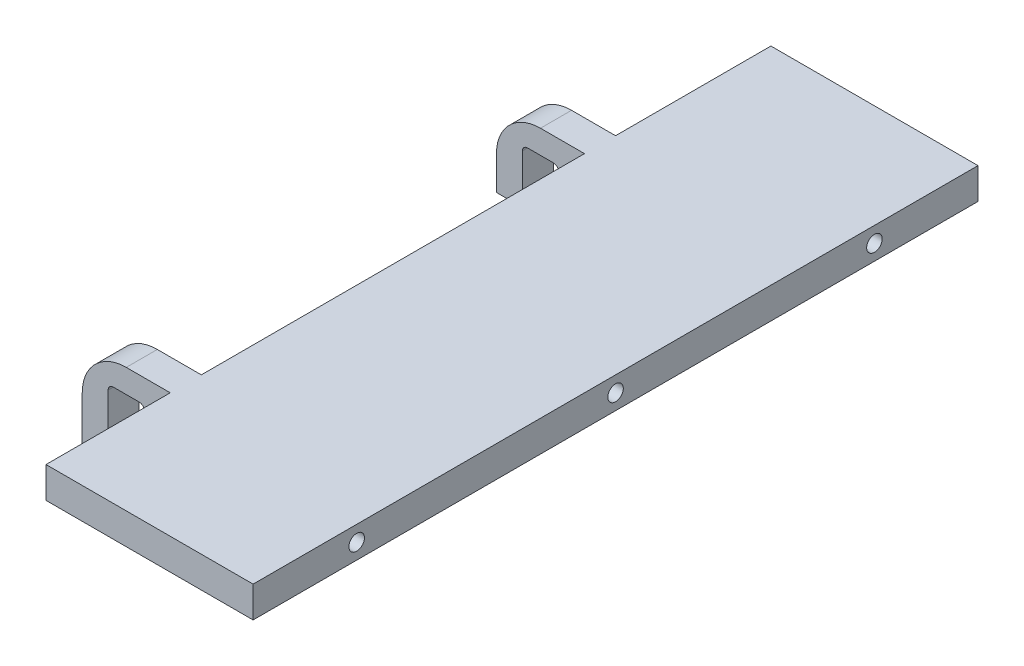
ISO-10303-21;
HEADER;
FILE_DESCRIPTION(('STEP AP214'),'2;1');
FILE_NAME('part.step','',(''),(''),'','','');
FILE_SCHEMA(('AUTOMOTIVE_DESIGN { 1 0 10303 214 1 1 1 1 }'));
ENDSEC;
DATA;
#1=APPLICATION_CONTEXT('core data for automotive mechanical design processes');
#2=APPLICATION_PROTOCOL_DEFINITION('international standard','automotive_design',2000,#1);
#3=PRODUCT_CONTEXT('',#1,'mechanical');
#4=PRODUCT('Part','Part','',(#3));
#5=PRODUCT_RELATED_PRODUCT_CATEGORY('part','',(#4));
#6=PRODUCT_DEFINITION_FORMATION('','',#4);
#7=PRODUCT_DEFINITION_CONTEXT('part definition',#1,'design');
#8=PRODUCT_DEFINITION('design','',#6,#7);
#9=PRODUCT_DEFINITION_SHAPE('','',#8);
#10=(LENGTH_UNIT() NAMED_UNIT(*) SI_UNIT(.MILLI.,.METRE.));
#11=(NAMED_UNIT(*) PLANE_ANGLE_UNIT() SI_UNIT($,.RADIAN.));
#12=(NAMED_UNIT(*) SI_UNIT($,.STERADIAN.) SOLID_ANGLE_UNIT());
#13=UNCERTAINTY_MEASURE_WITH_UNIT(LENGTH_MEASURE(1.E-05),#10,'distance_accuracy_value','');
#14=(GEOMETRIC_REPRESENTATION_CONTEXT(3) GLOBAL_UNCERTAINTY_ASSIGNED_CONTEXT((#13)) GLOBAL_UNIT_ASSIGNED_CONTEXT((#10,
#11,#12)) REPRESENTATION_CONTEXT('',''));
#15=CARTESIAN_POINT('',(0.,0.,0.));
#16=DIRECTION('',(0.,0.,1.));
#17=DIRECTION('',(1.,0.,0.));
#18=AXIS2_PLACEMENT_3D('',#15,#16,#17);
#19=CARTESIAN_POINT('',(11.,4.5,-15.));
#20=DIRECTION('',(-1.,0.,0.));
#21=DIRECTION('',(0.,0.,-1.));
#22=AXIS2_PLACEMENT_3D('',#19,#20,#21);
#23=PLANE('',#22);
#24=DIRECTION('',(0.,0.,-1.));
#25=VECTOR('',#24,1.);
#26=CARTESIAN_POINT('',(11.,7.5,-15.));
#27=LINE('',#26,#25);
#28=CARTESIAN_POINT('',(11.,7.5,40.));
#29=VERTEX_POINT('',#28);
#30=CARTESIAN_POINT('',(11.,7.5,3.));
#31=VERTEX_POINT('',#30);
#32=EDGE_CURVE('E353',#29,#31,#27,.T.);
#33=ORIENTED_EDGE('',*,*,#32,.T.);
#34=DIRECTION('',(0.,1.,0.));
#35=VECTOR('',#34,1.);
#36=CARTESIAN_POINT('',(11.,0.,3.));
#37=LINE('',#36,#35);
#38=CARTESIAN_POINT('',(11.,4.5,3.));
#39=VERTEX_POINT('',#38);
#40=EDGE_CURVE('E373',#39,#31,#37,.T.);
#41=ORIENTED_EDGE('',*,*,#40,.F.);
#42=DIRECTION('',(0.,0.,-1.));
#43=VECTOR('',#42,1.);
#44=CARTESIAN_POINT('',(11.,4.5,-15.));
#45=LINE('',#44,#43);
#46=CARTESIAN_POINT('',(11.,4.5,40.));
#47=VERTEX_POINT('',#46);
#48=EDGE_CURVE('E341',#47,#39,#45,.T.);
#49=ORIENTED_EDGE('',*,*,#48,.F.);
#50=DIRECTION('',(0.,1.,0.));
#51=VECTOR('',#50,1.);
#52=CARTESIAN_POINT('',(11.,0.,40.));
#53=LINE('',#52,#51);
#54=EDGE_CURVE('E310',#47,#29,#53,.T.);
#55=ORIENTED_EDGE('',*,*,#54,.T.);
#56=EDGE_LOOP('',(#33,#41,#49,#55));
#57=FACE_BOUND('',#56,.T.);
#58=ADVANCED_FACE('F36',(#57),#23,.T.);
#59=CARTESIAN_POINT('',(11.,0.,3.));
#60=DIRECTION('',(1.,0.,0.));
#61=DIRECTION('',(0.,0.,1.));
#62=AXIS2_PLACEMENT_3D('',#59,#60,#61);
#63=PLANE('',#62);
#64=CARTESIAN_POINT('',(11.,0.,3.));
#65=VERTEX_POINT('',#64);
#66=CARTESIAN_POINT('',(11.,1.5,3.));
#67=VERTEX_POINT('',#66);
#68=EDGE_CURVE('E374',#65,#67,#37,.T.);
#69=ORIENTED_EDGE('',*,*,#68,.F.);
#70=DIRECTION('',(0.,0.,-1.));
#71=VECTOR('',#70,1.);
#72=CARTESIAN_POINT('',(11.,0.,3.));
#73=LINE('',#72,#71);
#74=CARTESIAN_POINT('',(11.,0.,0.));
#75=VERTEX_POINT('',#74);
#76=EDGE_CURVE('E416',#65,#75,#73,.T.);
#77=ORIENTED_EDGE('',*,*,#76,.T.);
#78=DIRECTION('',(0.,1.,0.));
#79=VECTOR('',#78,1.);
#80=CARTESIAN_POINT('',(11.,0.,0.));
#81=LINE('',#80,#79);
#82=CARTESIAN_POINT('',(11.,1.5,0.));
#83=VERTEX_POINT('',#82);
#84=EDGE_CURVE('E396',#75,#83,#81,.T.);
#85=ORIENTED_EDGE('',*,*,#84,.T.);
#86=DIRECTION('',(0.,0.,-1.));
#87=VECTOR('',#86,1.);
#88=CARTESIAN_POINT('',(11.,1.5,3.));
#89=LINE('',#88,#87);
#90=EDGE_CURVE('E443',#67,#83,#89,.T.);
#91=ORIENTED_EDGE('',*,*,#90,.F.);
#92=EDGE_LOOP('',(#69,#77,#85,#91));
#93=FACE_BOUND('',#92,.T.);
#94=ADVANCED_FACE('F594',(#93),#63,.T.);
#95=CARTESIAN_POINT('',(2.5,0.,3.));
#96=DIRECTION('',(1.,0.,0.));
#97=DIRECTION('',(0.,0.,1.));
#98=AXIS2_PLACEMENT_3D('',#95,#96,#97);
#99=PLANE('',#98);
#100=DIRECTION('',(0.,1.,0.));
#101=VECTOR('',#100,1.);
#102=CARTESIAN_POINT('',(2.5,0.,0.));
#103=LINE('',#102,#101);
#104=CARTESIAN_POINT('',(2.5,0.,0.));
#105=VERTEX_POINT('',#104);
#106=CARTESIAN_POINT('',(2.5,3.25,0.));
#107=VERTEX_POINT('',#106);
#108=EDGE_CURVE('E358',#105,#107,#103,.T.);
#109=ORIENTED_EDGE('',*,*,#108,.F.);
#110=DIRECTION('',(0.,0.,-1.));
#111=VECTOR('',#110,1.);
#112=CARTESIAN_POINT('',(2.5,0.,3.));
#113=LINE('',#112,#111);
#114=CARTESIAN_POINT('',(2.5,0.,3.));
#115=VERTEX_POINT('',#114);
#116=EDGE_CURVE('E387',#115,#105,#113,.T.);
#117=ORIENTED_EDGE('',*,*,#116,.F.);
#118=DIRECTION('',(0.,1.,0.));
#119=VECTOR('',#118,1.);
#120=CARTESIAN_POINT('',(2.5,0.,3.));
#121=LINE('',#120,#119);
#122=CARTESIAN_POINT('',(2.5,3.25,3.));
#123=VERTEX_POINT('',#122);
#124=EDGE_CURVE('E364',#115,#123,#121,.T.);
#125=ORIENTED_EDGE('',*,*,#124,.T.);
#126=DIRECTION('',(0.,0.,-1.));
#127=VECTOR('',#126,1.);
#128=CARTESIAN_POINT('',(2.5,3.25,3.));
#129=LINE('',#128,#127);
#130=EDGE_CURVE('E422',#123,#107,#129,.T.);
#131=ORIENTED_EDGE('',*,*,#130,.T.);
#132=EDGE_LOOP('',(#109,#117,#125,#131));
#133=FACE_BOUND('',#132,.T.);
#134=ADVANCED_FACE('F519',(#133),#99,.F.);
#135=CARTESIAN_POINT('',(6.75,3.25,3.));
#136=DIRECTION('',(0.,0.,-1.));
#137=DIRECTION('',(1.,0.,0.));
#138=AXIS2_PLACEMENT_3D('',#135,#136,#137);
#139=CYLINDRICAL_SURFACE('',#138,4.25);
#140=CARTESIAN_POINT('',(6.75,3.25,0.));
#141=DIRECTION('',(0.,0.,-1.));
#142=DIRECTION('',(-1.,0.,0.));
#143=AXIS2_PLACEMENT_3D('',#140,#141,#142);
#144=CIRCLE('',#143,4.25);
#145=CARTESIAN_POINT('',(6.75,7.5,0.));
#146=VERTEX_POINT('',#145);
#147=EDGE_CURVE('E390',#107,#146,#144,.T.);
#148=ORIENTED_EDGE('',*,*,#147,.F.);
#149=ORIENTED_EDGE('',*,*,#130,.F.);
#150=CARTESIAN_POINT('',(6.75,3.25,3.));
#151=DIRECTION('',(0.,0.,-1.));
#152=DIRECTION('',(-1.,0.,0.));
#153=AXIS2_PLACEMENT_3D('',#150,#151,#152);
#154=CIRCLE('',#153,4.25);
#155=CARTESIAN_POINT('',(6.75,7.5,3.));
#156=VERTEX_POINT('',#155);
#157=EDGE_CURVE('E367',#123,#156,#154,.T.);
#158=ORIENTED_EDGE('',*,*,#157,.T.);
#159=DIRECTION('',(0.,0.,-1.));
#160=VECTOR('',#159,1.);
#161=CARTESIAN_POINT('',(6.75,7.5,3.));
#162=LINE('',#161,#160);
#163=EDGE_CURVE('E419',#156,#146,#162,.T.);
#164=ORIENTED_EDGE('',*,*,#163,.T.);
#165=EDGE_LOOP('',(#148,#149,#158,#164));
#166=FACE_BOUND('',#165,.T.);
#167=ADVANCED_FACE('F522',(#166),#139,.T.);
#168=CARTESIAN_POINT('',(5.,7.5,3.));
#169=DIRECTION('',(0.,1.,0.));
#170=DIRECTION('',(0.,0.,1.));
#171=AXIS2_PLACEMENT_3D('',#168,#169,#170);
#172=PLANE('',#171);
#173=DIRECTION('',(-1.,0.,0.));
#174=VECTOR('',#173,1.);
#175=CARTESIAN_POINT('',(5.,7.5,0.));
#176=LINE('',#175,#174);
#177=CARTESIAN_POINT('',(11.,7.5,0.));
#178=VERTEX_POINT('',#177);
#179=EDGE_CURVE('E393',#178,#146,#176,.T.);
#180=ORIENTED_EDGE('',*,*,#179,.T.);
#181=ORIENTED_EDGE('',*,*,#163,.F.);
#182=DIRECTION('',(-1.,0.,0.));
#183=VECTOR('',#182,1.);
#184=CARTESIAN_POINT('',(5.,7.5,3.));
#185=LINE('',#184,#183);
#186=EDGE_CURVE('E371',#31,#156,#185,.T.);
#187=ORIENTED_EDGE('',*,*,#186,.F.);
#188=ORIENTED_EDGE('',*,*,#32,.F.);
#189=DIRECTION('',(-1.,0.,0.));
#190=VECTOR('',#189,1.);
#191=CARTESIAN_POINT('',(5.,7.5,40.));
#192=LINE('',#191,#190);
#193=CARTESIAN_POINT('',(6.75,7.5,40.));
#194=VERTEX_POINT('',#193);
#195=EDGE_CURVE('E307',#29,#194,#192,.T.);
#196=ORIENTED_EDGE('',*,*,#195,.T.);
#197=DIRECTION('',(0.,0.,-1.));
#198=VECTOR('',#197,1.);
#199=CARTESIAN_POINT('',(6.75,7.5,43.));
#200=LINE('',#199,#198);
#201=CARTESIAN_POINT('',(6.75,7.5,43.));
#202=VERTEX_POINT('',#201);
#203=EDGE_CURVE('E323',#202,#194,#200,.T.);
#204=ORIENTED_EDGE('',*,*,#203,.F.);
#205=DIRECTION('',(-1.,0.,0.));
#206=VECTOR('',#205,1.);
#207=CARTESIAN_POINT('',(5.,7.5,43.));
#208=LINE('',#207,#206);
#209=CARTESIAN_POINT('',(11.,7.5,43.));
#210=VERTEX_POINT('',#209);
#211=EDGE_CURVE('E290',#210,#202,#208,.T.);
#212=ORIENTED_EDGE('',*,*,#211,.F.);
#213=CARTESIAN_POINT('',(11.,7.5,55.));
#214=VERTEX_POINT('',#213);
#215=EDGE_CURVE('E350',#214,#210,#27,.T.);
#216=ORIENTED_EDGE('',*,*,#215,.F.);
#217=DIRECTION('',(-1.,0.,0.));
#218=VECTOR('',#217,1.);
#219=CARTESIAN_POINT('',(31.,7.5,55.));
#220=LINE('',#219,#218);
#221=CARTESIAN_POINT('',(31.,7.5,55.));
#222=VERTEX_POINT('',#221);
#223=EDGE_CURVE('E346',#222,#214,#220,.T.);
#224=ORIENTED_EDGE('',*,*,#223,.F.);
#225=DIRECTION('',(0.,0.,1.));
#226=VECTOR('',#225,1.);
#227=CARTESIAN_POINT('',(31.,7.5,-15.));
#228=LINE('',#227,#226);
#229=CARTESIAN_POINT('',(31.,7.5,-15.));
#230=VERTEX_POINT('',#229);
#231=EDGE_CURVE('E329',#230,#222,#228,.T.);
#232=ORIENTED_EDGE('',*,*,#231,.F.);
#233=DIRECTION('',(1.,0.,0.));
#234=VECTOR('',#233,1.);
#235=CARTESIAN_POINT('',(31.,7.5,-15.));
#236=LINE('',#235,#234);
#237=CARTESIAN_POINT('',(11.,7.5,-15.));
#238=VERTEX_POINT('',#237);
#239=EDGE_CURVE('E334',#238,#230,#236,.T.);
#240=ORIENTED_EDGE('',*,*,#239,.F.);
#241=EDGE_CURVE('E349',#178,#238,#27,.T.);
#242=ORIENTED_EDGE('',*,*,#241,.F.);
#243=EDGE_LOOP('',(#180,#181,#187,#188,#196,#204,#212,#216,#224,#232,#240,#242));
#244=FACE_BOUND('',#243,.T.);
#245=ADVANCED_FACE('F528',(#244),#172,.T.);
#246=CARTESIAN_POINT('',(5.,0.,3.));
#247=DIRECTION('',(0.,1.,0.));
#248=DIRECTION('',(0.,0.,1.));
#249=AXIS2_PLACEMENT_3D('',#246,#247,#248);
#250=PLANE('',#249);
#251=DIRECTION('',(-1.,0.,0.));
#252=VECTOR('',#251,1.);
#253=CARTESIAN_POINT('',(5.,0.,0.));
#254=LINE('',#253,#252);
#255=CARTESIAN_POINT('',(8.5,0.,0.));
#256=VERTEX_POINT('',#255);
#257=EDGE_CURVE('E399',#75,#256,#254,.T.);
#258=ORIENTED_EDGE('',*,*,#257,.F.);
#259=ORIENTED_EDGE('',*,*,#76,.F.);
#260=DIRECTION('',(-1.,0.,0.));
#261=VECTOR('',#260,1.);
#262=CARTESIAN_POINT('',(5.,0.,3.));
#263=LINE('',#262,#261);
#264=CARTESIAN_POINT('',(8.5,0.,3.));
#265=VERTEX_POINT('',#264);
#266=EDGE_CURVE('E377',#65,#265,#263,.T.);
#267=ORIENTED_EDGE('',*,*,#266,.T.);
#268=DIRECTION('',(0.,0.,-1.));
#269=VECTOR('',#268,1.);
#270=CARTESIAN_POINT('',(8.5,0.,3.));
#271=LINE('',#270,#269);
#272=EDGE_CURVE('E413',#265,#256,#271,.T.);
#273=ORIENTED_EDGE('',*,*,#272,.T.);
#274=EDGE_LOOP('',(#258,#259,#267,#273));
#275=FACE_BOUND('',#274,.T.);
#276=ADVANCED_FACE('F501',(#275),#250,.F.);
#277=CARTESIAN_POINT('',(8.5,0.,3.));
#278=DIRECTION('',(-1.,0.,0.));
#279=DIRECTION('',(0.,1.,0.));
#280=AXIS2_PLACEMENT_3D('',#277,#278,#279);
#281=PLANE('',#280);
#282=DIRECTION('',(0.,-1.,0.));
#283=VECTOR('',#282,1.);
#284=CARTESIAN_POINT('',(8.5,0.,0.));
#285=LINE('',#284,#283);
#286=CARTESIAN_POINT('',(8.5,4.72806038091198,0.));
#287=VERTEX_POINT('',#286);
#288=EDGE_CURVE('E402',#287,#256,#285,.T.);
#289=ORIENTED_EDGE('',*,*,#288,.T.);
#290=ORIENTED_EDGE('',*,*,#272,.F.);
#291=DIRECTION('',(0.,-1.,0.));
#292=VECTOR('',#291,1.);
#293=CARTESIAN_POINT('',(8.5,0.,3.));
#294=LINE('',#293,#292);
#295=CARTESIAN_POINT('',(8.5,4.72806038091198,3.));
#296=VERTEX_POINT('',#295);
#297=EDGE_CURVE('E380',#296,#265,#294,.T.);
#298=ORIENTED_EDGE('',*,*,#297,.F.);
#299=DIRECTION('',(0.,0.,1.));
#300=VECTOR('',#299,1.);
#301=CARTESIAN_POINT('',(8.5,4.72806038091198,3.));
#302=LINE('',#301,#300);
#303=EDGE_CURVE('E467',#287,#296,#302,.T.);
#304=ORIENTED_EDGE('',*,*,#303,.F.);
#305=EDGE_LOOP('',(#289,#290,#298,#304));
#306=FACE_BOUND('',#305,.T.);
#307=ADVANCED_FACE('F495',(#306),#281,.T.);
#308=CARTESIAN_POINT('',(5.,0.,3.));
#309=DIRECTION('',(1.,0.,0.));
#310=DIRECTION('',(0.,0.,1.));
#311=AXIS2_PLACEMENT_3D('',#308,#309,#310);
#312=PLANE('',#311);
#313=DIRECTION('',(0.,1.,0.));
#314=VECTOR('',#313,1.);
#315=CARTESIAN_POINT('',(5.,0.,3.));
#316=LINE('',#315,#314);
#317=CARTESIAN_POINT('',(5.,0.,3.));
#318=VERTEX_POINT('',#317);
#319=CARTESIAN_POINT('',(5.,4.72806038091198,3.));
#320=VERTEX_POINT('',#319);
#321=EDGE_CURVE('E382',#318,#320,#316,.T.);
#322=ORIENTED_EDGE('',*,*,#321,.F.);
#323=DIRECTION('',(0.,0.,-1.));
#324=VECTOR('',#323,1.);
#325=CARTESIAN_POINT('',(5.,0.,3.));
#326=LINE('',#325,#324);
#327=CARTESIAN_POINT('',(5.,0.,0.));
#328=VERTEX_POINT('',#327);
#329=EDGE_CURVE('E410',#318,#328,#326,.T.);
#330=ORIENTED_EDGE('',*,*,#329,.T.);
#331=DIRECTION('',(0.,1.,0.));
#332=VECTOR('',#331,1.);
#333=CARTESIAN_POINT('',(5.,0.,0.));
#334=LINE('',#333,#332);
#335=CARTESIAN_POINT('',(5.,4.72806038091198,0.));
#336=VERTEX_POINT('',#335);
#337=EDGE_CURVE('E404',#328,#336,#334,.T.);
#338=ORIENTED_EDGE('',*,*,#337,.T.);
#339=DIRECTION('',(0.,0.,1.));
#340=VECTOR('',#339,1.);
#341=CARTESIAN_POINT('',(5.,4.72806038091198,3.));
#342=LINE('',#341,#340);
#343=EDGE_CURVE('E474',#320,#336,#342,.F.);
#344=ORIENTED_EDGE('',*,*,#343,.F.);
#345=EDGE_LOOP('',(#322,#330,#338,#344));
#346=FACE_BOUND('',#345,.T.);
#347=ADVANCED_FACE('F511',(#346),#312,.T.);
#348=CARTESIAN_POINT('',(5.,0.,3.));
#349=DIRECTION('',(0.,1.,0.));
#350=DIRECTION('',(0.,0.,1.));
#351=AXIS2_PLACEMENT_3D('',#348,#349,#350);
#352=PLANE('',#351);
#353=DIRECTION('',(-1.,0.,0.));
#354=VECTOR('',#353,1.);
#355=CARTESIAN_POINT('',(5.,0.,0.));
#356=LINE('',#355,#354);
#357=EDGE_CURVE('E368',#328,#105,#356,.T.);
#358=ORIENTED_EDGE('',*,*,#357,.F.);
#359=ORIENTED_EDGE('',*,*,#329,.F.);
#360=DIRECTION('',(-1.,0.,0.));
#361=VECTOR('',#360,1.);
#362=CARTESIAN_POINT('',(5.,0.,3.));
#363=LINE('',#362,#361);
#364=EDGE_CURVE('E385',#318,#115,#363,.T.);
#365=ORIENTED_EDGE('',*,*,#364,.T.);
#366=ORIENTED_EDGE('',*,*,#116,.T.);
#367=EDGE_LOOP('',(#358,#359,#365,#366));
#368=FACE_BOUND('',#367,.T.);
#369=ADVANCED_FACE('F516',(#368),#352,.F.);
#370=CARTESIAN_POINT('',(5.,0.,3.));
#371=DIRECTION('',(0.,0.,1.));
#372=DIRECTION('',(-1.,0.,0.));
#373=AXIS2_PLACEMENT_3D('',#370,#371,#372);
#374=PLANE('',#373);
#375=ORIENTED_EDGE('',*,*,#297,.T.);
#376=ORIENTED_EDGE('',*,*,#266,.F.);
#377=ORIENTED_EDGE('',*,*,#68,.T.);
#378=CARTESIAN_POINT('',(14.,1.5,3.));
#379=DIRECTION('',(0.,0.,-1.));
#380=DIRECTION('',(-1.,0.,0.));
#381=AXIS2_PLACEMENT_3D('',#378,#379,#380);
#382=CIRCLE('',#381,3.);
#383=CARTESIAN_POINT('',(14.,4.5,3.));
#384=VERTEX_POINT('',#383);
#385=EDGE_CURVE('E453',#384,#67,#382,.F.);
#386=ORIENTED_EDGE('',*,*,#385,.F.);
#387=DIRECTION('',(-1.,0.,0.));
#388=VECTOR('',#387,1.);
#389=CARTESIAN_POINT('',(5.,4.5,3.));
#390=LINE('',#389,#388);
#391=EDGE_CURVE('E428',#384,#39,#390,.T.);
#392=ORIENTED_EDGE('',*,*,#391,.T.);
#393=ORIENTED_EDGE('',*,*,#40,.T.);
#394=ORIENTED_EDGE('',*,*,#186,.T.);
#395=ORIENTED_EDGE('',*,*,#157,.F.);
#396=ORIENTED_EDGE('',*,*,#124,.F.);
#397=ORIENTED_EDGE('',*,*,#364,.F.);
#398=ORIENTED_EDGE('',*,*,#321,.T.);
#399=CARTESIAN_POINT('',(5.5,4.72806038091198,3.));
#400=DIRECTION('',(0.,0.,-1.));
#401=DIRECTION('',(-1.,0.,0.));
#402=AXIS2_PLACEMENT_3D('',#399,#400,#401);
#403=CIRCLE('',#402,0.5);
#404=CARTESIAN_POINT('',(5.5,5.22806038091198,3.));
#405=VERTEX_POINT('',#404);
#406=EDGE_CURVE('E44',#405,#320,#403,.F.);
#407=ORIENTED_EDGE('',*,*,#406,.F.);
#408=DIRECTION('',(1.,0.,0.));
#409=VECTOR('',#408,1.);
#410=CARTESIAN_POINT('',(5.,5.22806038091198,3.));
#411=LINE('',#410,#409);
#412=CARTESIAN_POINT('',(8.,5.22806038091198,3.));
#413=VERTEX_POINT('',#412);
#414=EDGE_CURVE('E282',#405,#413,#411,.T.);
#415=ORIENTED_EDGE('',*,*,#414,.T.);
#416=CARTESIAN_POINT('',(8.,4.72806038091198,3.));
#417=DIRECTION('',(0.,0.,-1.));
#418=DIRECTION('',(-1.,0.,0.));
#419=AXIS2_PLACEMENT_3D('',#416,#417,#418);
#420=CIRCLE('',#419,0.5);
#421=EDGE_CURVE('E484',#296,#413,#420,.F.);
#422=ORIENTED_EDGE('',*,*,#421,.F.);
#423=EDGE_LOOP('',(#375,#376,#377,#386,#392,#393,#394,#395,#396,#397,#398,#407,#415,#422));
#424=FACE_BOUND('',#423,.T.);
#425=ADVANCED_FACE('F504',(#424),#374,.T.);
#426=CARTESIAN_POINT('',(5.,0.,0.));
#427=DIRECTION('',(0.,0.,1.));
#428=DIRECTION('',(-1.,0.,0.));
#429=AXIS2_PLACEMENT_3D('',#426,#427,#428);
#430=PLANE('',#429);
#431=ORIENTED_EDGE('',*,*,#337,.F.);
#432=ORIENTED_EDGE('',*,*,#357,.T.);
#433=ORIENTED_EDGE('',*,*,#108,.T.);
#434=ORIENTED_EDGE('',*,*,#147,.T.);
#435=ORIENTED_EDGE('',*,*,#179,.F.);
#436=CARTESIAN_POINT('',(11.,4.5,0.));
#437=VERTEX_POINT('',#436);
#438=EDGE_CURVE('E395',#437,#178,#81,.T.);
#439=ORIENTED_EDGE('',*,*,#438,.F.);
#440=DIRECTION('',(1.,0.,0.));
#441=VECTOR('',#440,1.);
#442=CARTESIAN_POINT('',(5.,4.5,0.));
#443=LINE('',#442,#441);
#444=CARTESIAN_POINT('',(14.,4.5,0.));
#445=VERTEX_POINT('',#444);
#446=EDGE_CURVE('E432',#437,#445,#443,.T.);
#447=ORIENTED_EDGE('',*,*,#446,.T.);
#448=CARTESIAN_POINT('',(14.,1.5,0.));
#449=DIRECTION('',(0.,0.,-1.));
#450=DIRECTION('',(-1.,0.,0.));
#451=AXIS2_PLACEMENT_3D('',#448,#449,#450);
#452=CIRCLE('',#451,3.);
#453=EDGE_CURVE('E450',#83,#445,#452,.T.);
#454=ORIENTED_EDGE('',*,*,#453,.F.);
#455=ORIENTED_EDGE('',*,*,#84,.F.);
#456=ORIENTED_EDGE('',*,*,#257,.T.);
#457=ORIENTED_EDGE('',*,*,#288,.F.);
#458=CARTESIAN_POINT('',(8.,4.72806038091198,0.));
#459=DIRECTION('',(0.,0.,-1.));
#460=DIRECTION('',(-1.,0.,0.));
#461=AXIS2_PLACEMENT_3D('',#458,#459,#460);
#462=CIRCLE('',#461,0.5);
#463=CARTESIAN_POINT('',(8.,5.22806038091198,0.));
#464=VERTEX_POINT('',#463);
#465=EDGE_CURVE('E487',#464,#287,#462,.T.);
#466=ORIENTED_EDGE('',*,*,#465,.F.);
#467=DIRECTION('',(1.,0.,0.));
#468=VECTOR('',#467,1.);
#469=CARTESIAN_POINT('',(5.,5.22806038091198,0.));
#470=LINE('',#469,#468);
#471=CARTESIAN_POINT('',(5.5,5.22806038091198,0.));
#472=VERTEX_POINT('',#471);
#473=EDGE_CURVE('E279',#472,#464,#470,.T.);
#474=ORIENTED_EDGE('',*,*,#473,.F.);
#475=CARTESIAN_POINT('',(5.5,4.72806038091198,0.));
#476=DIRECTION('',(0.,0.,-1.));
#477=DIRECTION('',(-1.,0.,0.));
#478=AXIS2_PLACEMENT_3D('',#475,#476,#477);
#479=CIRCLE('',#478,0.5);
#480=EDGE_CURVE('E11',#336,#472,#479,.T.);
#481=ORIENTED_EDGE('',*,*,#480,.F.);
#482=EDGE_LOOP('',(#431,#432,#433,#434,#435,#439,#447,#454,#455,#456,#457,#466,#474,#481));
#483=FACE_BOUND('',#482,.T.);
#484=ADVANCED_FACE('F497',(#483),#430,.F.);
#485=ORIENTED_EDGE('',*,*,#438,.T.);
#486=ORIENTED_EDGE('',*,*,#241,.T.);
#487=DIRECTION('',(0.,1.,0.));
#488=VECTOR('',#487,1.);
#489=CARTESIAN_POINT('',(11.,4.5,-15.));
#490=LINE('',#489,#488);
#491=CARTESIAN_POINT('',(11.,4.5,-15.));
#492=VERTEX_POINT('',#491);
#493=EDGE_CURVE('E359',#492,#238,#490,.T.);
#494=ORIENTED_EDGE('',*,*,#493,.F.);
#495=EDGE_CURVE('E336',#437,#492,#45,.T.);
#496=ORIENTED_EDGE('',*,*,#495,.F.);
#497=EDGE_LOOP('',(#485,#486,#494,#496));
#498=FACE_BOUND('',#497,.T.);
#499=ADVANCED_FACE('F551',(#498),#23,.T.);
#500=CARTESIAN_POINT('',(31.,4.5,-15.));
#501=DIRECTION('',(1.,0.,0.));
#502=DIRECTION('',(0.,0.,1.));
#503=AXIS2_PLACEMENT_3D('',#500,#501,#502);
#504=PLANE('',#503);
#505=CARTESIAN_POINT('',(31.,6.,-5.));
#506=DIRECTION('',(-1.,0.,0.));
#507=DIRECTION('',(0.,0.,1.));
#508=AXIS2_PLACEMENT_3D('',#505,#506,#507);
#509=CIRCLE('',#508,0.749999999999998);
#510=CARTESIAN_POINT('',(31.,6.,-4.25));
#511=VERTEX_POINT('',#510);
#512=EDGE_CURVE('E841',#511,#511,#509,.T.);
#513=ORIENTED_EDGE('',*,*,#512,.T.);
#514=EDGE_LOOP('',(#513));
#515=FACE_BOUND('',#514,.T.);
#516=CARTESIAN_POINT('',(31.,6.,20.));
#517=DIRECTION('',(-1.,0.,0.));
#518=DIRECTION('',(0.,0.,1.));
#519=AXIS2_PLACEMENT_3D('',#516,#517,#518);
#520=CIRCLE('',#519,0.750000000000002);
#521=CARTESIAN_POINT('',(31.,6.,20.75));
#522=VERTEX_POINT('',#521);
#523=EDGE_CURVE('E849',#522,#522,#520,.T.);
#524=ORIENTED_EDGE('',*,*,#523,.T.);
#525=EDGE_LOOP('',(#524));
#526=FACE_BOUND('',#525,.T.);
#527=CARTESIAN_POINT('',(31.,6.,45.));
#528=DIRECTION('',(-1.,0.,0.));
#529=DIRECTION('',(0.,0.,1.));
#530=AXIS2_PLACEMENT_3D('',#527,#528,#529);
#531=CIRCLE('',#530,0.749999999999999);
#532=CARTESIAN_POINT('',(31.,6.,45.75));
#533=VERTEX_POINT('',#532);
#534=EDGE_CURVE('E855',#533,#533,#531,.T.);
#535=ORIENTED_EDGE('',*,*,#534,.T.);
#536=EDGE_LOOP('',(#535));
#537=FACE_BOUND('',#536,.T.);
#538=ORIENTED_EDGE('',*,*,#231,.T.);
#539=DIRECTION('',(0.,1.,0.));
#540=VECTOR('',#539,1.);
#541=CARTESIAN_POINT('',(31.,4.5,55.));
#542=LINE('',#541,#540);
#543=CARTESIAN_POINT('',(31.,4.5,55.));
#544=VERTEX_POINT('',#543);
#545=EDGE_CURVE('E343',#544,#222,#542,.T.);
#546=ORIENTED_EDGE('',*,*,#545,.F.);
#547=DIRECTION('',(0.,0.,1.));
#548=VECTOR('',#547,1.);
#549=CARTESIAN_POINT('',(31.,4.5,-15.));
#550=LINE('',#549,#548);
#551=CARTESIAN_POINT('',(31.,4.5,-15.));
#552=VERTEX_POINT('',#551);
#553=EDGE_CURVE('E330',#552,#544,#550,.T.);
#554=ORIENTED_EDGE('',*,*,#553,.F.);
#555=DIRECTION('',(0.,1.,0.));
#556=VECTOR('',#555,1.);
#557=CARTESIAN_POINT('',(31.,4.5,-15.));
#558=LINE('',#557,#556);
#559=EDGE_CURVE('E356',#552,#230,#558,.T.);
#560=ORIENTED_EDGE('',*,*,#559,.T.);
#561=EDGE_LOOP('',(#538,#546,#554,#560));
#562=FACE_BOUND('',#561,.T.);
#563=ADVANCED_FACE('F557',(#515,#526,#537,#562),#504,.T.);
#564=CARTESIAN_POINT('',(31.,4.5,-15.));
#565=DIRECTION('',(0.,0.,-1.));
#566=DIRECTION('',(1.,0.,0.));
#567=AXIS2_PLACEMENT_3D('',#564,#565,#566);
#568=PLANE('',#567);
#569=ORIENTED_EDGE('',*,*,#239,.T.);
#570=ORIENTED_EDGE('',*,*,#559,.F.);
#571=DIRECTION('',(1.,0.,0.));
#572=VECTOR('',#571,1.);
#573=CARTESIAN_POINT('',(31.,4.5,-15.));
#574=LINE('',#573,#572);
#575=EDGE_CURVE('E340',#492,#552,#574,.T.);
#576=ORIENTED_EDGE('',*,*,#575,.F.);
#577=ORIENTED_EDGE('',*,*,#493,.T.);
#578=EDGE_LOOP('',(#569,#570,#576,#577));
#579=FACE_BOUND('',#578,.T.);
#580=ADVANCED_FACE('F553',(#579),#568,.T.);
#581=DIRECTION('',(0.,1.,0.));
#582=VECTOR('',#581,1.);
#583=CARTESIAN_POINT('',(11.,0.,43.));
#584=LINE('',#583,#582);
#585=CARTESIAN_POINT('',(11.,4.5,43.));
#586=VERTEX_POINT('',#585);
#587=EDGE_CURVE('E293',#586,#210,#584,.T.);
#588=ORIENTED_EDGE('',*,*,#587,.F.);
#589=CARTESIAN_POINT('',(11.,4.5,55.));
#590=VERTEX_POINT('',#589);
#591=EDGE_CURVE('E337',#590,#586,#45,.T.);
#592=ORIENTED_EDGE('',*,*,#591,.F.);
#593=DIRECTION('',(0.,1.,0.));
#594=VECTOR('',#593,1.);
#595=CARTESIAN_POINT('',(11.,4.5,55.));
#596=LINE('',#595,#594);
#597=EDGE_CURVE('E361',#590,#214,#596,.T.);
#598=ORIENTED_EDGE('',*,*,#597,.T.);
#599=ORIENTED_EDGE('',*,*,#215,.T.);
#600=EDGE_LOOP('',(#588,#592,#598,#599));
#601=FACE_BOUND('',#600,.T.);
#602=ADVANCED_FACE('F567',(#601),#23,.T.);
#603=CARTESIAN_POINT('',(31.,4.5,55.));
#604=DIRECTION('',(0.,0.,1.));
#605=DIRECTION('',(-1.,0.,0.));
#606=AXIS2_PLACEMENT_3D('',#603,#604,#605);
#607=PLANE('',#606);
#608=ORIENTED_EDGE('',*,*,#223,.T.);
#609=ORIENTED_EDGE('',*,*,#597,.F.);
#610=DIRECTION('',(-1.,0.,0.));
#611=VECTOR('',#610,1.);
#612=CARTESIAN_POINT('',(31.,4.5,55.));
#613=LINE('',#612,#611);
#614=EDGE_CURVE('E333',#544,#590,#613,.T.);
#615=ORIENTED_EDGE('',*,*,#614,.F.);
#616=ORIENTED_EDGE('',*,*,#545,.T.);
#617=EDGE_LOOP('',(#608,#609,#615,#616));
#618=FACE_BOUND('',#617,.T.);
#619=ADVANCED_FACE('F563',(#618),#607,.T.);
#620=CARTESIAN_POINT('',(5.,4.5,0.));
#621=DIRECTION('',(0.,1.,0.));
#622=DIRECTION('',(0.,0.,1.));
#623=AXIS2_PLACEMENT_3D('',#620,#621,#622);
#624=PLANE('',#623);
#625=ORIENTED_EDGE('',*,*,#48,.T.);
#626=ORIENTED_EDGE('',*,*,#391,.F.);
#627=DIRECTION('',(0.,0.,-1.));
#628=VECTOR('',#627,1.);
#629=CARTESIAN_POINT('',(14.,4.5,0.));
#630=LINE('',#629,#628);
#631=EDGE_CURVE('E430',#445,#384,#630,.F.);
#632=ORIENTED_EDGE('',*,*,#631,.F.);
#633=ORIENTED_EDGE('',*,*,#446,.F.);
#634=ORIENTED_EDGE('',*,*,#495,.T.);
#635=ORIENTED_EDGE('',*,*,#575,.T.);
#636=ORIENTED_EDGE('',*,*,#553,.T.);
#637=ORIENTED_EDGE('',*,*,#614,.T.);
#638=ORIENTED_EDGE('',*,*,#591,.T.);
#639=DIRECTION('',(-1.,0.,0.));
#640=VECTOR('',#639,1.);
#641=CARTESIAN_POINT('',(5.,4.5,43.));
#642=LINE('',#641,#640);
#643=CARTESIAN_POINT('',(14.,4.5,43.));
#644=VERTEX_POINT('',#643);
#645=EDGE_CURVE('E435',#644,#586,#642,.T.);
#646=ORIENTED_EDGE('',*,*,#645,.F.);
#647=DIRECTION('',(0.,0.,-1.));
#648=VECTOR('',#647,1.);
#649=CARTESIAN_POINT('',(14.,4.5,0.));
#650=LINE('',#649,#648);
#651=CARTESIAN_POINT('',(14.,4.5,40.));
#652=VERTEX_POINT('',#651);
#653=EDGE_CURVE('E437',#652,#644,#650,.F.);
#654=ORIENTED_EDGE('',*,*,#653,.F.);
#655=DIRECTION('',(1.,0.,0.));
#656=VECTOR('',#655,1.);
#657=CARTESIAN_POINT('',(5.,4.5,40.));
#658=LINE('',#657,#656);
#659=EDGE_CURVE('E440',#47,#652,#658,.T.);
#660=ORIENTED_EDGE('',*,*,#659,.F.);
#661=EDGE_LOOP('',(#625,#626,#632,#633,#634,#635,#636,#637,#638,#646,#654,#660));
#662=FACE_BOUND('',#661,.T.);
#663=ADVANCED_FACE('F546',(#662),#624,.F.);
#664=CARTESIAN_POINT('',(11.,0.,43.));
#665=DIRECTION('',(1.,0.,0.));
#666=DIRECTION('',(0.,0.,1.));
#667=AXIS2_PLACEMENT_3D('',#664,#665,#666);
#668=PLANE('',#667);
#669=CARTESIAN_POINT('',(11.,0.,43.));
#670=VERTEX_POINT('',#669);
#671=CARTESIAN_POINT('',(11.,1.5,43.));
#672=VERTEX_POINT('',#671);
#673=EDGE_CURVE('E294',#670,#672,#584,.T.);
#674=ORIENTED_EDGE('',*,*,#673,.F.);
#675=DIRECTION('',(0.,0.,-1.));
#676=VECTOR('',#675,1.);
#677=CARTESIAN_POINT('',(11.,0.,43.));
#678=LINE('',#677,#676);
#679=CARTESIAN_POINT('',(11.,0.,40.));
#680=VERTEX_POINT('',#679);
#681=EDGE_CURVE('E320',#670,#680,#678,.T.);
#682=ORIENTED_EDGE('',*,*,#681,.T.);
#683=CARTESIAN_POINT('',(11.,1.5,40.));
#684=VERTEX_POINT('',#683);
#685=EDGE_CURVE('E311',#680,#684,#53,.T.);
#686=ORIENTED_EDGE('',*,*,#685,.T.);
#687=DIRECTION('',(0.,0.,-1.));
#688=VECTOR('',#687,1.);
#689=CARTESIAN_POINT('',(11.,1.5,43.));
#690=LINE('',#689,#688);
#691=EDGE_CURVE('E425',#672,#684,#690,.T.);
#692=ORIENTED_EDGE('',*,*,#691,.F.);
#693=EDGE_LOOP('',(#674,#682,#686,#692));
#694=FACE_BOUND('',#693,.T.);
#695=ADVANCED_FACE('F582',(#694),#668,.T.);
#696=CARTESIAN_POINT('',(2.5,0.,43.));
#697=DIRECTION('',(1.,0.,0.));
#698=DIRECTION('',(0.,0.,1.));
#699=AXIS2_PLACEMENT_3D('',#696,#697,#698);
#700=PLANE('',#699);
#701=DIRECTION('',(0.,1.,0.));
#702=VECTOR('',#701,1.);
#703=CARTESIAN_POINT('',(2.5,0.,40.));
#704=LINE('',#703,#702);
#705=CARTESIAN_POINT('',(2.5,-3.,40.));
#706=VERTEX_POINT('',#705);
#707=CARTESIAN_POINT('',(2.5,3.25,40.));
#708=VERTEX_POINT('',#707);
#709=EDGE_CURVE('E285',#706,#708,#704,.T.);
#710=ORIENTED_EDGE('',*,*,#709,.F.);
#711=DIRECTION('',(0.,0.,1.));
#712=VECTOR('',#711,1.);
#713=CARTESIAN_POINT('',(2.5,-3.,40.));
#714=LINE('',#713,#712);
#715=CARTESIAN_POINT('',(2.5,-3.,43.));
#716=VERTEX_POINT('',#715);
#717=EDGE_CURVE('E251',#706,#716,#714,.T.);
#718=ORIENTED_EDGE('',*,*,#717,.T.);
#719=DIRECTION('',(0.,1.,0.));
#720=VECTOR('',#719,1.);
#721=CARTESIAN_POINT('',(2.5,0.,43.));
#722=LINE('',#721,#720);
#723=CARTESIAN_POINT('',(2.5,3.25,43.));
#724=VERTEX_POINT('',#723);
#725=EDGE_CURVE('E266',#716,#724,#722,.T.);
#726=ORIENTED_EDGE('',*,*,#725,.T.);
#727=DIRECTION('',(0.,0.,-1.));
#728=VECTOR('',#727,1.);
#729=CARTESIAN_POINT('',(2.5,3.25,43.));
#730=LINE('',#729,#728);
#731=EDGE_CURVE('E326',#724,#708,#730,.T.);
#732=ORIENTED_EDGE('',*,*,#731,.T.);
#733=EDGE_LOOP('',(#710,#718,#726,#732));
#734=FACE_BOUND('',#733,.T.);
#735=ADVANCED_FACE('F580',(#734),#700,.F.);
#736=CARTESIAN_POINT('',(6.75,3.25,43.));
#737=DIRECTION('',(0.,0.,-1.));
#738=DIRECTION('',(1.,0.,0.));
#739=AXIS2_PLACEMENT_3D('',#736,#737,#738);
#740=CYLINDRICAL_SURFACE('',#739,4.25);
#741=CARTESIAN_POINT('',(6.75,3.25,40.));
#742=DIRECTION('',(0.,0.,-1.));
#743=DIRECTION('',(-1.,0.,0.));
#744=AXIS2_PLACEMENT_3D('',#741,#742,#743);
#745=CIRCLE('',#744,4.25);
#746=EDGE_CURVE('E305',#708,#194,#745,.T.);
#747=ORIENTED_EDGE('',*,*,#746,.F.);
#748=ORIENTED_EDGE('',*,*,#731,.F.);
#749=CARTESIAN_POINT('',(6.75,3.25,43.));
#750=DIRECTION('',(0.,0.,-1.));
#751=DIRECTION('',(-1.,0.,0.));
#752=AXIS2_PLACEMENT_3D('',#749,#750,#751);
#753=CIRCLE('',#752,4.25);
#754=EDGE_CURVE('E288',#724,#202,#753,.T.);
#755=ORIENTED_EDGE('',*,*,#754,.T.);
#756=ORIENTED_EDGE('',*,*,#203,.T.);
#757=EDGE_LOOP('',(#747,#748,#755,#756));
#758=FACE_BOUND('',#757,.T.);
#759=ADVANCED_FACE('F577',(#758),#740,.T.);
#760=CARTESIAN_POINT('',(5.,0.,43.));
#761=DIRECTION('',(0.,1.,0.));
#762=DIRECTION('',(0.,0.,1.));
#763=AXIS2_PLACEMENT_3D('',#760,#761,#762);
#764=PLANE('',#763);
#765=DIRECTION('',(-1.,0.,0.));
#766=VECTOR('',#765,1.);
#767=CARTESIAN_POINT('',(5.,0.,40.));
#768=LINE('',#767,#766);
#769=CARTESIAN_POINT('',(8.5,0.,40.));
#770=VERTEX_POINT('',#769);
#771=EDGE_CURVE('E314',#680,#770,#768,.T.);
#772=ORIENTED_EDGE('',*,*,#771,.F.);
#773=ORIENTED_EDGE('',*,*,#681,.F.);
#774=DIRECTION('',(-1.,0.,0.));
#775=VECTOR('',#774,1.);
#776=CARTESIAN_POINT('',(5.,0.,43.));
#777=LINE('',#776,#775);
#778=CARTESIAN_POINT('',(8.5,0.,43.));
#779=VERTEX_POINT('',#778);
#780=EDGE_CURVE('E297',#670,#779,#777,.T.);
#781=ORIENTED_EDGE('',*,*,#780,.T.);
#782=DIRECTION('',(0.,0.,-1.));
#783=VECTOR('',#782,1.);
#784=CARTESIAN_POINT('',(8.5,0.,43.));
#785=LINE('',#784,#783);
#786=EDGE_CURVE('E303',#779,#770,#785,.T.);
#787=ORIENTED_EDGE('',*,*,#786,.T.);
#788=EDGE_LOOP('',(#772,#773,#781,#787));
#789=FACE_BOUND('',#788,.T.);
#790=ADVANCED_FACE('F588',(#789),#764,.F.);
#791=CARTESIAN_POINT('',(8.5,0.,43.));
#792=DIRECTION('',(-1.,0.,0.));
#793=DIRECTION('',(0.,1.,0.));
#794=AXIS2_PLACEMENT_3D('',#791,#792,#793);
#795=PLANE('',#794);
#796=DIRECTION('',(0.,-1.,0.));
#797=VECTOR('',#796,1.);
#798=CARTESIAN_POINT('',(8.5,0.,40.));
#799=LINE('',#798,#797);
#800=CARTESIAN_POINT('',(8.5,4.72806038091198,40.));
#801=VERTEX_POINT('',#800);
#802=EDGE_CURVE('E267',#801,#770,#799,.T.);
#803=ORIENTED_EDGE('',*,*,#802,.T.);
#804=ORIENTED_EDGE('',*,*,#786,.F.);
#805=DIRECTION('',(0.,-1.,0.));
#806=VECTOR('',#805,1.);
#807=CARTESIAN_POINT('',(8.5,0.,43.));
#808=LINE('',#807,#806);
#809=CARTESIAN_POINT('',(8.5,4.72806038091198,43.));
#810=VERTEX_POINT('',#809);
#811=EDGE_CURVE('E300',#810,#779,#808,.T.);
#812=ORIENTED_EDGE('',*,*,#811,.F.);
#813=DIRECTION('',(0.,0.,1.));
#814=VECTOR('',#813,1.);
#815=CARTESIAN_POINT('',(8.5,4.72806038091198,43.));
#816=LINE('',#815,#814);
#817=EDGE_CURVE('E464',#801,#810,#816,.T.);
#818=ORIENTED_EDGE('',*,*,#817,.F.);
#819=EDGE_LOOP('',(#803,#804,#812,#818));
#820=FACE_BOUND('',#819,.T.);
#821=ADVANCED_FACE('F651',(#820),#795,.T.);
#822=CARTESIAN_POINT('',(5.,0.,43.));
#823=DIRECTION('',(1.,0.,0.));
#824=DIRECTION('',(0.,0.,1.));
#825=AXIS2_PLACEMENT_3D('',#822,#823,#824);
#826=PLANE('',#825);
#827=DIRECTION('',(0.,1.,0.));
#828=VECTOR('',#827,1.);
#829=CARTESIAN_POINT('',(5.,0.,43.));
#830=LINE('',#829,#828);
#831=CARTESIAN_POINT('',(5.,-3.,43.));
#832=VERTEX_POINT('',#831);
#833=CARTESIAN_POINT('',(5.,4.72806038091198,43.));
#834=VERTEX_POINT('',#833);
#835=EDGE_CURVE('E271',#832,#834,#830,.T.);
#836=ORIENTED_EDGE('',*,*,#835,.F.);
#837=DIRECTION('',(0.,0.,1.));
#838=VECTOR('',#837,1.);
#839=CARTESIAN_POINT('',(5.,-3.,40.));
#840=LINE('',#839,#838);
#841=CARTESIAN_POINT('',(5.,-3.,40.));
#842=VERTEX_POINT('',#841);
#843=EDGE_CURVE('E248',#842,#832,#840,.T.);
#844=ORIENTED_EDGE('',*,*,#843,.F.);
#845=DIRECTION('',(0.,1.,0.));
#846=VECTOR('',#845,1.);
#847=CARTESIAN_POINT('',(5.,0.,40.));
#848=LINE('',#847,#846);
#849=CARTESIAN_POINT('',(5.,4.72806038091198,40.));
#850=VERTEX_POINT('',#849);
#851=EDGE_CURVE('E258',#842,#850,#848,.T.);
#852=ORIENTED_EDGE('',*,*,#851,.T.);
#853=DIRECTION('',(0.,0.,1.));
#854=VECTOR('',#853,1.);
#855=CARTESIAN_POINT('',(5.,4.72806038091198,43.));
#856=LINE('',#855,#854);
#857=EDGE_CURVE('E462',#834,#850,#856,.F.);
#858=ORIENTED_EDGE('',*,*,#857,.F.);
#859=EDGE_LOOP('',(#836,#844,#852,#858));
#860=FACE_BOUND('',#859,.T.);
#861=ADVANCED_FACE('F269',(#860),#826,.T.);
#862=CARTESIAN_POINT('',(5.,0.,43.));
#863=DIRECTION('',(0.,0.,1.));
#864=DIRECTION('',(-1.,0.,0.));
#865=AXIS2_PLACEMENT_3D('',#862,#863,#864);
#866=PLANE('',#865);
#867=ORIENTED_EDGE('',*,*,#811,.T.);
#868=ORIENTED_EDGE('',*,*,#780,.F.);
#869=ORIENTED_EDGE('',*,*,#673,.T.);
#870=CARTESIAN_POINT('',(14.,1.5,43.));
#871=DIRECTION('',(0.,0.,-1.));
#872=DIRECTION('',(-1.,0.,0.));
#873=AXIS2_PLACEMENT_3D('',#870,#871,#872);
#874=CIRCLE('',#873,3.);
#875=EDGE_CURVE('E448',#644,#672,#874,.F.);
#876=ORIENTED_EDGE('',*,*,#875,.F.);
#877=ORIENTED_EDGE('',*,*,#645,.T.);
#878=ORIENTED_EDGE('',*,*,#587,.T.);
#879=ORIENTED_EDGE('',*,*,#211,.T.);
#880=ORIENTED_EDGE('',*,*,#754,.F.);
#881=ORIENTED_EDGE('',*,*,#725,.F.);
#882=DIRECTION('',(-1.,0.,0.));
#883=VECTOR('',#882,1.);
#884=CARTESIAN_POINT('',(2.5,-3.,43.));
#885=LINE('',#884,#883);
#886=EDGE_CURVE('E255',#832,#716,#885,.T.);
#887=ORIENTED_EDGE('',*,*,#886,.F.);
#888=ORIENTED_EDGE('',*,*,#835,.T.);
#889=CARTESIAN_POINT('',(5.5,4.72806038091198,43.));
#890=DIRECTION('',(0.,0.,-1.));
#891=DIRECTION('',(-1.,0.,0.));
#892=AXIS2_PLACEMENT_3D('',#889,#890,#891);
#893=CIRCLE('',#892,0.5);
#894=CARTESIAN_POINT('',(5.5,5.22806038091198,43.));
#895=VERTEX_POINT('',#894);
#896=EDGE_CURVE('E476',#895,#834,#893,.F.);
#897=ORIENTED_EDGE('',*,*,#896,.F.);
#898=DIRECTION('',(1.,0.,0.));
#899=VECTOR('',#898,1.);
#900=CARTESIAN_POINT('',(5.,5.22806038091198,43.));
#901=LINE('',#900,#899);
#902=CARTESIAN_POINT('',(8.,5.22806038091198,43.));
#903=VERTEX_POINT('',#902);
#904=EDGE_CURVE('E273',#895,#903,#901,.T.);
#905=ORIENTED_EDGE('',*,*,#904,.T.);
#906=CARTESIAN_POINT('',(8.,4.72806038091198,43.));
#907=DIRECTION('',(0.,0.,-1.));
#908=DIRECTION('',(-1.,0.,0.));
#909=AXIS2_PLACEMENT_3D('',#906,#907,#908);
#910=CIRCLE('',#909,0.5);
#911=EDGE_CURVE('E479',#810,#903,#910,.F.);
#912=ORIENTED_EDGE('',*,*,#911,.F.);
#913=EDGE_LOOP('',(#867,#868,#869,#876,#877,#878,#879,#880,#881,#887,#888,#897,#905,#912));
#914=FACE_BOUND('',#913,.T.);
#915=ADVANCED_FACE('F570',(#914),#866,.T.);
#916=CARTESIAN_POINT('',(5.,0.,40.));
#917=DIRECTION('',(0.,0.,1.));
#918=DIRECTION('',(-1.,0.,0.));
#919=AXIS2_PLACEMENT_3D('',#916,#917,#918);
#920=PLANE('',#919);
#921=ORIENTED_EDGE('',*,*,#851,.F.);
#922=DIRECTION('',(-1.,0.,0.));
#923=VECTOR('',#922,1.);
#924=CARTESIAN_POINT('',(2.5,-3.,40.));
#925=LINE('',#924,#923);
#926=EDGE_CURVE('E244',#842,#706,#925,.T.);
#927=ORIENTED_EDGE('',*,*,#926,.T.);
#928=ORIENTED_EDGE('',*,*,#709,.T.);
#929=ORIENTED_EDGE('',*,*,#746,.T.);
#930=ORIENTED_EDGE('',*,*,#195,.F.);
#931=ORIENTED_EDGE('',*,*,#54,.F.);
#932=ORIENTED_EDGE('',*,*,#659,.T.);
#933=CARTESIAN_POINT('',(14.,1.5,40.));
#934=DIRECTION('',(0.,0.,-1.));
#935=DIRECTION('',(-1.,0.,0.));
#936=AXIS2_PLACEMENT_3D('',#933,#934,#935);
#937=CIRCLE('',#936,3.);
#938=EDGE_CURVE('E446',#684,#652,#937,.T.);
#939=ORIENTED_EDGE('',*,*,#938,.F.);
#940=ORIENTED_EDGE('',*,*,#685,.F.);
#941=ORIENTED_EDGE('',*,*,#771,.T.);
#942=ORIENTED_EDGE('',*,*,#802,.F.);
#943=CARTESIAN_POINT('',(8.,4.72806038091198,40.));
#944=DIRECTION('',(0.,0.,-1.));
#945=DIRECTION('',(-1.,0.,0.));
#946=AXIS2_PLACEMENT_3D('',#943,#944,#945);
#947=CIRCLE('',#946,0.5);
#948=CARTESIAN_POINT('',(8.,5.22806038091198,40.));
#949=VERTEX_POINT('',#948);
#950=EDGE_CURVE('E482',#949,#801,#947,.T.);
#951=ORIENTED_EDGE('',*,*,#950,.F.);
#952=DIRECTION('',(1.,0.,0.));
#953=VECTOR('',#952,1.);
#954=CARTESIAN_POINT('',(5.,5.22806038091198,40.));
#955=LINE('',#954,#953);
#956=CARTESIAN_POINT('',(5.5,5.22806038091198,40.));
#957=VERTEX_POINT('',#956);
#958=EDGE_CURVE('E455',#957,#949,#955,.T.);
#959=ORIENTED_EDGE('',*,*,#958,.F.);
#960=CARTESIAN_POINT('',(5.5,4.72806038091198,40.));
#961=DIRECTION('',(0.,0.,-1.));
#962=DIRECTION('',(-1.,0.,0.));
#963=AXIS2_PLACEMENT_3D('',#960,#961,#962);
#964=CIRCLE('',#963,0.5);
#965=EDGE_CURVE('E262',#850,#957,#964,.T.);
#966=ORIENTED_EDGE('',*,*,#965,.F.);
#967=EDGE_LOOP('',(#921,#927,#928,#929,#930,#931,#932,#939,#940,#941,#942,#951,#959,#966));
#968=FACE_BOUND('',#967,.T.);
#969=ADVANCED_FACE('F259',(#968),#920,.F.);
#970=CARTESIAN_POINT('',(14.,1.5,43.));
#971=DIRECTION('',(0.,0.,-1.));
#972=DIRECTION('',(1.,0.,0.));
#973=AXIS2_PLACEMENT_3D('',#970,#971,#972);
#974=CYLINDRICAL_SURFACE('',#973,3.);
#975=ORIENTED_EDGE('',*,*,#875,.T.);
#976=ORIENTED_EDGE('',*,*,#691,.T.);
#977=ORIENTED_EDGE('',*,*,#938,.T.);
#978=ORIENTED_EDGE('',*,*,#653,.T.);
#979=EDGE_LOOP('',(#975,#976,#977,#978));
#980=FACE_BOUND('',#979,.T.);
#981=ADVANCED_FACE('F572',(#980),#974,.F.);
#982=CARTESIAN_POINT('',(14.,1.5,3.));
#983=DIRECTION('',(0.,0.,-1.));
#984=DIRECTION('',(1.,0.,0.));
#985=AXIS2_PLACEMENT_3D('',#982,#983,#984);
#986=CYLINDRICAL_SURFACE('',#985,3.);
#987=ORIENTED_EDGE('',*,*,#385,.T.);
#988=ORIENTED_EDGE('',*,*,#90,.T.);
#989=ORIENTED_EDGE('',*,*,#453,.T.);
#990=ORIENTED_EDGE('',*,*,#631,.T.);
#991=EDGE_LOOP('',(#987,#988,#989,#990));
#992=FACE_BOUND('',#991,.T.);
#993=ADVANCED_FACE('F709',(#992),#986,.F.);
#994=CARTESIAN_POINT('',(8.5,5.22806038091198,-15.));
#995=DIRECTION('',(0.,1.,0.));
#996=DIRECTION('',(0.,0.,1.));
#997=AXIS2_PLACEMENT_3D('',#994,#995,#996);
#998=PLANE('',#997);
#999=ORIENTED_EDGE('',*,*,#958,.T.);
#1000=DIRECTION('',(0.,0.,1.));
#1001=VECTOR('',#1000,1.);
#1002=CARTESIAN_POINT('',(8.,5.22806038091198,-15.));
#1003=LINE('',#1002,#1001);
#1004=EDGE_CURVE('E458',#903,#949,#1003,.F.);
#1005=ORIENTED_EDGE('',*,*,#1004,.F.);
#1006=ORIENTED_EDGE('',*,*,#904,.F.);
#1007=DIRECTION('',(0.,0.,1.));
#1008=VECTOR('',#1007,1.);
#1009=CARTESIAN_POINT('',(5.5,5.22806038091198,-15.));
#1010=LINE('',#1009,#1008);
#1011=EDGE_CURVE('E460',#957,#895,#1010,.T.);
#1012=ORIENTED_EDGE('',*,*,#1011,.F.);
#1013=EDGE_LOOP('',(#999,#1005,#1006,#1012));
#1014=FACE_BOUND('',#1013,.T.);
#1015=ADVANCED_FACE('F718',(#1014),#998,.F.);
#1016=ORIENTED_EDGE('',*,*,#414,.F.);
#1017=DIRECTION('',(0.,0.,1.));
#1018=VECTOR('',#1017,1.);
#1019=CARTESIAN_POINT('',(5.5,5.22806038091198,-15.));
#1020=LINE('',#1019,#1018);
#1021=EDGE_CURVE('E470',#472,#405,#1020,.T.);
#1022=ORIENTED_EDGE('',*,*,#1021,.F.);
#1023=ORIENTED_EDGE('',*,*,#473,.T.);
#1024=DIRECTION('',(0.,0.,1.));
#1025=VECTOR('',#1024,1.);
#1026=CARTESIAN_POINT('',(8.,5.22806038091198,-15.));
#1027=LINE('',#1026,#1025);
#1028=EDGE_CURVE('E472',#413,#464,#1027,.F.);
#1029=ORIENTED_EDGE('',*,*,#1028,.F.);
#1030=EDGE_LOOP('',(#1016,#1022,#1023,#1029));
#1031=FACE_BOUND('',#1030,.T.);
#1032=ADVANCED_FACE('F508',(#1031),#998,.F.);
#1033=CARTESIAN_POINT('',(5.5,4.72806038091198,-15.));
#1034=DIRECTION('',(0.,0.,1.));
#1035=DIRECTION('',(-1.,0.,0.));
#1036=AXIS2_PLACEMENT_3D('',#1033,#1034,#1035);
#1037=CYLINDRICAL_SURFACE('',#1036,0.5);
#1038=ORIENTED_EDGE('',*,*,#965,.T.);
#1039=ORIENTED_EDGE('',*,*,#1011,.T.);
#1040=ORIENTED_EDGE('',*,*,#896,.T.);
#1041=ORIENTED_EDGE('',*,*,#857,.T.);
#1042=EDGE_LOOP('',(#1038,#1039,#1040,#1041));
#1043=FACE_BOUND('',#1042,.T.);
#1044=ADVANCED_FACE('F737',(#1043),#1037,.F.);
#1045=CARTESIAN_POINT('',(8.,4.72806038091198,43.));
#1046=DIRECTION('',(0.,0.,1.));
#1047=DIRECTION('',(-1.,0.,0.));
#1048=AXIS2_PLACEMENT_3D('',#1045,#1046,#1047);
#1049=CYLINDRICAL_SURFACE('',#1048,0.5);
#1050=ORIENTED_EDGE('',*,*,#950,.T.);
#1051=ORIENTED_EDGE('',*,*,#817,.T.);
#1052=ORIENTED_EDGE('',*,*,#911,.T.);
#1053=ORIENTED_EDGE('',*,*,#1004,.T.);
#1054=EDGE_LOOP('',(#1050,#1051,#1052,#1053));
#1055=FACE_BOUND('',#1054,.T.);
#1056=ADVANCED_FACE('F745',(#1055),#1049,.F.);
#1057=CARTESIAN_POINT('',(8.,4.72806038091198,3.));
#1058=DIRECTION('',(0.,0.,1.));
#1059=DIRECTION('',(-1.,0.,0.));
#1060=AXIS2_PLACEMENT_3D('',#1057,#1058,#1059);
#1061=CYLINDRICAL_SURFACE('',#1060,0.5);
#1062=ORIENTED_EDGE('',*,*,#465,.T.);
#1063=ORIENTED_EDGE('',*,*,#303,.T.);
#1064=ORIENTED_EDGE('',*,*,#421,.T.);
#1065=ORIENTED_EDGE('',*,*,#1028,.T.);
#1066=EDGE_LOOP('',(#1062,#1063,#1064,#1065));
#1067=FACE_BOUND('',#1066,.T.);
#1068=ADVANCED_FACE('F491',(#1067),#1061,.F.);
#1069=CARTESIAN_POINT('',(5.5,4.72806038091198,-15.));
#1070=DIRECTION('',(0.,0.,1.));
#1071=DIRECTION('',(-1.,0.,0.));
#1072=AXIS2_PLACEMENT_3D('',#1069,#1070,#1071);
#1073=CYLINDRICAL_SURFACE('',#1072,0.5);
#1074=ORIENTED_EDGE('',*,*,#480,.T.);
#1075=ORIENTED_EDGE('',*,*,#1021,.T.);
#1076=ORIENTED_EDGE('',*,*,#406,.T.);
#1077=ORIENTED_EDGE('',*,*,#343,.T.);
#1078=EDGE_LOOP('',(#1074,#1075,#1076,#1077));
#1079=FACE_BOUND('',#1078,.T.);
#1080=ADVANCED_FACE('F38',(#1079),#1073,.F.);
#1081=CARTESIAN_POINT('',(2.5,-3.,40.));
#1082=DIRECTION('',(0.,-1.,0.));
#1083=DIRECTION('',(-1.,0.,0.));
#1084=AXIS2_PLACEMENT_3D('',#1081,#1082,#1083);
#1085=PLANE('',#1084);
#1086=ORIENTED_EDGE('',*,*,#886,.T.);
#1087=ORIENTED_EDGE('',*,*,#717,.F.);
#1088=ORIENTED_EDGE('',*,*,#926,.F.);
#1089=ORIENTED_EDGE('',*,*,#843,.T.);
#1090=EDGE_LOOP('',(#1086,#1087,#1088,#1089));
#1091=FACE_BOUND('',#1090,.T.);
#1092=ADVANCED_FACE('F246',(#1091),#1085,.T.);
#1093=CARTESIAN_POINT('',(26.,6.,45.));
#1094=DIRECTION('',(1.,0.,0.));
#1095=DIRECTION('',(0.,0.,1.));
#1096=AXIS2_PLACEMENT_3D('',#1093,#1094,#1095);
#1097=CYLINDRICAL_SURFACE('',#1096,0.749999999999999);
#1098=CARTESIAN_POINT('',(26.,6.,45.));
#1099=DIRECTION('',(-1.,0.,0.));
#1100=DIRECTION('',(0.,0.,1.));
#1101=AXIS2_PLACEMENT_3D('',#1098,#1099,#1100);
#1102=CIRCLE('',#1101,0.749999999999999);
#1103=CARTESIAN_POINT('',(26.,6.,45.75));
#1104=VERTEX_POINT('',#1103);
#1105=EDGE_CURVE('E852',#1104,#1104,#1102,.T.);
#1106=ORIENTED_EDGE('',*,*,#1105,.T.);
#1107=EDGE_LOOP('',(#1106));
#1108=FACE_BOUND('',#1107,.T.);
#1109=ORIENTED_EDGE('',*,*,#534,.F.);
#1110=EDGE_LOOP('',(#1109));
#1111=FACE_BOUND('',#1110,.T.);
#1112=ADVANCED_FACE('F776',(#1108,#1111),#1097,.F.);
#1113=CARTESIAN_POINT('',(26.,6.,45.));
#1114=DIRECTION('',(1.,0.,0.));
#1115=DIRECTION('',(0.,0.,1.));
#1116=AXIS2_PLACEMENT_3D('',#1113,#1114,#1115);
#1117=PLANE('',#1116);
#1118=ORIENTED_EDGE('',*,*,#1105,.F.);
#1119=EDGE_LOOP('',(#1118));
#1120=FACE_BOUND('',#1119,.T.);
#1121=ADVANCED_FACE('F785',(#1120),#1117,.T.);
#1122=CARTESIAN_POINT('',(26.,6.,20.));
#1123=DIRECTION('',(1.,0.,0.));
#1124=DIRECTION('',(0.,0.,1.));
#1125=AXIS2_PLACEMENT_3D('',#1122,#1123,#1124);
#1126=CYLINDRICAL_SURFACE('',#1125,0.750000000000002);
#1127=CARTESIAN_POINT('',(26.,6.,20.));
#1128=DIRECTION('',(-1.,0.,0.));
#1129=DIRECTION('',(0.,0.,1.));
#1130=AXIS2_PLACEMENT_3D('',#1127,#1128,#1129);
#1131=CIRCLE('',#1130,0.750000000000002);
#1132=CARTESIAN_POINT('',(26.,6.,20.75));
#1133=VERTEX_POINT('',#1132);
#1134=EDGE_CURVE('E844',#1133,#1133,#1131,.T.);
#1135=ORIENTED_EDGE('',*,*,#1134,.T.);
#1136=EDGE_LOOP('',(#1135));
#1137=FACE_BOUND('',#1136,.T.);
#1138=ORIENTED_EDGE('',*,*,#523,.F.);
#1139=EDGE_LOOP('',(#1138));
#1140=FACE_BOUND('',#1139,.T.);
#1141=ADVANCED_FACE('F795',(#1137,#1140),#1126,.F.);
#1142=CARTESIAN_POINT('',(26.,6.,20.));
#1143=DIRECTION('',(1.,0.,0.));
#1144=DIRECTION('',(0.,0.,1.));
#1145=AXIS2_PLACEMENT_3D('',#1142,#1143,#1144);
#1146=PLANE('',#1145);
#1147=ORIENTED_EDGE('',*,*,#1134,.F.);
#1148=EDGE_LOOP('',(#1147));
#1149=FACE_BOUND('',#1148,.T.);
#1150=ADVANCED_FACE('F805',(#1149),#1146,.T.);
#1151=CARTESIAN_POINT('',(26.,6.,-5.));
#1152=DIRECTION('',(1.,0.,0.));
#1153=DIRECTION('',(0.,0.,1.));
#1154=AXIS2_PLACEMENT_3D('',#1151,#1152,#1153);
#1155=CYLINDRICAL_SURFACE('',#1154,0.749999999999998);
#1156=CARTESIAN_POINT('',(26.,6.,-5.));
#1157=DIRECTION('',(-1.,0.,0.));
#1158=DIRECTION('',(0.,0.,1.));
#1159=AXIS2_PLACEMENT_3D('',#1156,#1157,#1158);
#1160=CIRCLE('',#1159,0.749999999999998);
#1161=CARTESIAN_POINT('',(26.,6.,-4.25));
#1162=VERTEX_POINT('',#1161);
#1163=EDGE_CURVE('E840',#1162,#1162,#1160,.T.);
#1164=ORIENTED_EDGE('',*,*,#1163,.T.);
#1165=EDGE_LOOP('',(#1164));
#1166=FACE_BOUND('',#1165,.T.);
#1167=ORIENTED_EDGE('',*,*,#512,.F.);
#1168=EDGE_LOOP('',(#1167));
#1169=FACE_BOUND('',#1168,.T.);
#1170=ADVANCED_FACE('F815',(#1166,#1169),#1155,.F.);
#1171=CARTESIAN_POINT('',(26.,6.,-5.));
#1172=DIRECTION('',(1.,0.,0.));
#1173=DIRECTION('',(0.,0.,1.));
#1174=AXIS2_PLACEMENT_3D('',#1171,#1172,#1173);
#1175=PLANE('',#1174);
#1176=ORIENTED_EDGE('',*,*,#1163,.F.);
#1177=EDGE_LOOP('',(#1176));
#1178=FACE_BOUND('',#1177,.T.);
#1179=ADVANCED_FACE('F825',(#1178),#1175,.T.);
#1180=CLOSED_SHELL('',(#58,#94,#134,#167,#245,#276,#307,#347,#369,#425,#484,#499,#563,#580,#602,
#619,#663,#695,#735,#759,#790,#821,#861,#915,#969,#981,#993,#1015,#1032,#1044,#1056,#1068,#1080,
#1092,#1112,#1121,#1141,#1150,#1170,#1179));
#1181=MANIFOLD_SOLID_BREP('B2',#1180);
#1182=ADVANCED_BREP_SHAPE_REPRESENTATION('',(#18,#1181),#14);
#1183=SHAPE_DEFINITION_REPRESENTATION(#9,#1182);
ENDSEC;
END-ISO-10303-21;
